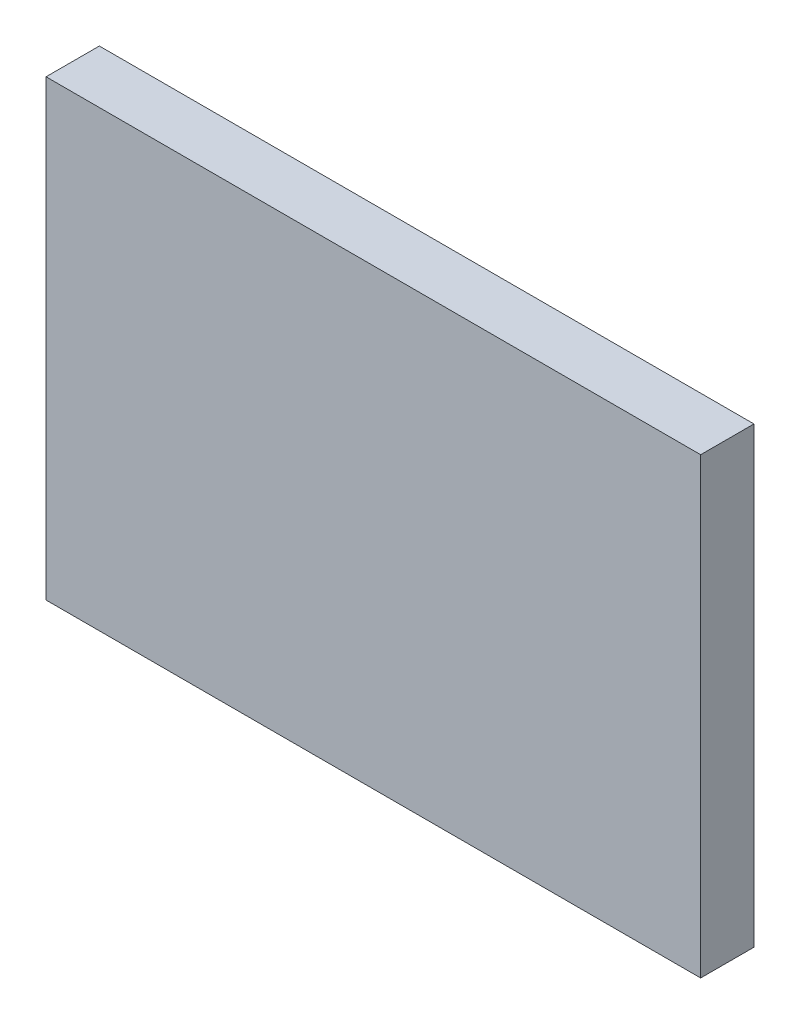
ISO-10303-21;
HEADER;
FILE_DESCRIPTION(('STEP AP214'),'2;1');
FILE_NAME('part.step','',(''),(''),'','','');
FILE_SCHEMA(('AUTOMOTIVE_DESIGN { 1 0 10303 214 1 1 1 1 }'));
ENDSEC;
DATA;
#1=APPLICATION_CONTEXT('core data for automotive mechanical design processes');
#2=APPLICATION_PROTOCOL_DEFINITION('international standard','automotive_design',2000,#1);
#3=PRODUCT_CONTEXT('',#1,'mechanical');
#4=PRODUCT('Part','Part','',(#3));
#5=PRODUCT_RELATED_PRODUCT_CATEGORY('part','',(#4));
#6=PRODUCT_DEFINITION_FORMATION('','',#4);
#7=PRODUCT_DEFINITION_CONTEXT('part definition',#1,'design');
#8=PRODUCT_DEFINITION('design','',#6,#7);
#9=PRODUCT_DEFINITION_SHAPE('','',#8);
#10=(LENGTH_UNIT() NAMED_UNIT(*) SI_UNIT(.MILLI.,.METRE.));
#11=(NAMED_UNIT(*) PLANE_ANGLE_UNIT() SI_UNIT($,.RADIAN.));
#12=(NAMED_UNIT(*) SI_UNIT($,.STERADIAN.) SOLID_ANGLE_UNIT());
#13=UNCERTAINTY_MEASURE_WITH_UNIT(LENGTH_MEASURE(1.E-05),#10,'distance_accuracy_value','');
#14=(GEOMETRIC_REPRESENTATION_CONTEXT(3) GLOBAL_UNCERTAINTY_ASSIGNED_CONTEXT((#13)) GLOBAL_UNIT_ASSIGNED_CONTEXT((#10,
#11,#12)) REPRESENTATION_CONTEXT('',''));
#15=CARTESIAN_POINT('',(0.,0.,0.));
#16=DIRECTION('',(0.,0.,1.));
#17=DIRECTION('',(1.,0.,0.));
#18=AXIS2_PLACEMENT_3D('',#15,#16,#17);
#19=CARTESIAN_POINT('',(-19.5,-13.5,3.175));
#20=DIRECTION('',(1.,0.,0.));
#21=DIRECTION('',(0.,0.,-1.));
#22=AXIS2_PLACEMENT_3D('',#19,#20,#21);
#23=PLANE('',#22);
#24=DIRECTION('',(0.,-1.,0.));
#25=VECTOR('',#24,1.);
#26=CARTESIAN_POINT('',(-19.5,-13.5,0.));
#27=LINE('',#26,#25);
#28=CARTESIAN_POINT('',(-19.5,13.5,0.));
#29=VERTEX_POINT('',#28);
#30=CARTESIAN_POINT('',(-19.5,-13.5,0.));
#31=VERTEX_POINT('',#30);
#32=EDGE_CURVE('E96',#29,#31,#27,.T.);
#33=ORIENTED_EDGE('',*,*,#32,.T.);
#34=DIRECTION('',(0.,0.,-1.));
#35=VECTOR('',#34,1.);
#36=CARTESIAN_POINT('',(-19.5,-13.5,3.175));
#37=LINE('',#36,#35);
#38=CARTESIAN_POINT('',(-19.5,-13.5,3.175));
#39=VERTEX_POINT('',#38);
#40=EDGE_CURVE('E11',#39,#31,#37,.T.);
#41=ORIENTED_EDGE('',*,*,#40,.F.);
#42=DIRECTION('',(0.,-1.,0.));
#43=VECTOR('',#42,1.);
#44=CARTESIAN_POINT('',(-19.5,-13.5,3.175));
#45=LINE('',#44,#43);
#46=CARTESIAN_POINT('',(-19.5,13.5,3.175));
#47=VERTEX_POINT('',#46);
#48=EDGE_CURVE('E84',#47,#39,#45,.T.);
#49=ORIENTED_EDGE('',*,*,#48,.F.);
#50=DIRECTION('',(0.,0.,-1.));
#51=VECTOR('',#50,1.);
#52=CARTESIAN_POINT('',(-19.5,13.5,3.175));
#53=LINE('',#52,#51);
#54=EDGE_CURVE('E92',#47,#29,#53,.T.);
#55=ORIENTED_EDGE('',*,*,#54,.T.);
#56=EDGE_LOOP('',(#33,#41,#49,#55));
#57=FACE_BOUND('',#56,.T.);
#58=ADVANCED_FACE('F33',(#57),#23,.F.);
#59=CARTESIAN_POINT('',(19.5,-13.5,3.175));
#60=DIRECTION('',(0.,1.,0.));
#61=DIRECTION('',(-1.,0.,0.));
#62=AXIS2_PLACEMENT_3D('',#59,#60,#61);
#63=PLANE('',#62);
#64=DIRECTION('',(1.,0.,0.));
#65=VECTOR('',#64,1.);
#66=CARTESIAN_POINT('',(19.5,-13.5,0.));
#67=LINE('',#66,#65);
#68=CARTESIAN_POINT('',(19.5,-13.5,0.));
#69=VERTEX_POINT('',#68);
#70=EDGE_CURVE('E88',#31,#69,#67,.T.);
#71=ORIENTED_EDGE('',*,*,#70,.T.);
#72=DIRECTION('',(0.,0.,-1.));
#73=VECTOR('',#72,1.);
#74=CARTESIAN_POINT('',(19.5,-13.5,3.175));
#75=LINE('',#74,#73);
#76=CARTESIAN_POINT('',(19.5,-13.5,3.175));
#77=VERTEX_POINT('',#76);
#78=EDGE_CURVE('E41',#77,#69,#75,.T.);
#79=ORIENTED_EDGE('',*,*,#78,.F.);
#80=DIRECTION('',(1.,0.,0.));
#81=VECTOR('',#80,1.);
#82=CARTESIAN_POINT('',(19.5,-13.5,3.175));
#83=LINE('',#82,#81);
#84=EDGE_CURVE('E79',#39,#77,#83,.T.);
#85=ORIENTED_EDGE('',*,*,#84,.F.);
#86=ORIENTED_EDGE('',*,*,#40,.T.);
#87=EDGE_LOOP('',(#71,#79,#85,#86));
#88=FACE_BOUND('',#87,.T.);
#89=ADVANCED_FACE('F87',(#88),#63,.F.);
#90=CARTESIAN_POINT('',(19.5,-13.5,3.175));
#91=DIRECTION('',(-1.,0.,0.));
#92=DIRECTION('',(0.,0.,1.));
#93=AXIS2_PLACEMENT_3D('',#90,#91,#92);
#94=PLANE('',#93);
#95=DIRECTION('',(0.,1.,0.));
#96=VECTOR('',#95,1.);
#97=CARTESIAN_POINT('',(19.5,-13.5,0.));
#98=LINE('',#97,#96);
#99=CARTESIAN_POINT('',(19.5,13.5,0.));
#100=VERTEX_POINT('',#99);
#101=EDGE_CURVE('E66',#69,#100,#98,.T.);
#102=ORIENTED_EDGE('',*,*,#101,.T.);
#103=DIRECTION('',(0.,0.,-1.));
#104=VECTOR('',#103,1.);
#105=CARTESIAN_POINT('',(19.5,13.5,3.175));
#106=LINE('',#105,#104);
#107=CARTESIAN_POINT('',(19.5,13.5,3.175));
#108=VERTEX_POINT('',#107);
#109=EDGE_CURVE('E89',#108,#100,#106,.T.);
#110=ORIENTED_EDGE('',*,*,#109,.F.);
#111=DIRECTION('',(0.,1.,0.));
#112=VECTOR('',#111,1.);
#113=CARTESIAN_POINT('',(19.5,-13.5,3.175));
#114=LINE('',#113,#112);
#115=EDGE_CURVE('E82',#77,#108,#114,.T.);
#116=ORIENTED_EDGE('',*,*,#115,.F.);
#117=ORIENTED_EDGE('',*,*,#78,.T.);
#118=EDGE_LOOP('',(#102,#110,#116,#117));
#119=FACE_BOUND('',#118,.T.);
#120=ADVANCED_FACE('F90',(#119),#94,.F.);
#121=CARTESIAN_POINT('',(19.5,13.5,3.175));
#122=DIRECTION('',(0.,-1.,0.));
#123=DIRECTION('',(1.,0.,0.));
#124=AXIS2_PLACEMENT_3D('',#121,#122,#123);
#125=PLANE('',#124);
#126=DIRECTION('',(-1.,0.,0.));
#127=VECTOR('',#126,1.);
#128=CARTESIAN_POINT('',(19.5,13.5,0.));
#129=LINE('',#128,#127);
#130=EDGE_CURVE('E72',#100,#29,#129,.T.);
#131=ORIENTED_EDGE('',*,*,#130,.T.);
#132=ORIENTED_EDGE('',*,*,#54,.F.);
#133=DIRECTION('',(-1.,0.,0.));
#134=VECTOR('',#133,1.);
#135=CARTESIAN_POINT('',(19.5,13.5,3.175));
#136=LINE('',#135,#134);
#137=EDGE_CURVE('E49',#108,#47,#136,.T.);
#138=ORIENTED_EDGE('',*,*,#137,.F.);
#139=ORIENTED_EDGE('',*,*,#109,.T.);
#140=EDGE_LOOP('',(#131,#132,#138,#139));
#141=FACE_BOUND('',#140,.T.);
#142=ADVANCED_FACE('F103',(#141),#125,.F.);
#143=CARTESIAN_POINT('',(0.,0.,3.175));
#144=DIRECTION('',(0.,0.,1.));
#145=DIRECTION('',(1.,0.,0.));
#146=AXIS2_PLACEMENT_3D('',#143,#144,#145);
#147=PLANE('',#146);
#148=ORIENTED_EDGE('',*,*,#48,.T.);
#149=ORIENTED_EDGE('',*,*,#84,.T.);
#150=ORIENTED_EDGE('',*,*,#115,.T.);
#151=ORIENTED_EDGE('',*,*,#137,.T.);
#152=EDGE_LOOP('',(#148,#149,#150,#151));
#153=FACE_BOUND('',#152,.T.);
#154=ADVANCED_FACE('F80',(#153),#147,.T.);
#155=CARTESIAN_POINT('',(0.,0.,0.));
#156=DIRECTION('',(0.,0.,1.));
#157=DIRECTION('',(1.,0.,0.));
#158=AXIS2_PLACEMENT_3D('',#155,#156,#157);
#159=PLANE('',#158);
#160=ORIENTED_EDGE('',*,*,#32,.F.);
#161=ORIENTED_EDGE('',*,*,#130,.F.);
#162=ORIENTED_EDGE('',*,*,#101,.F.);
#163=ORIENTED_EDGE('',*,*,#70,.F.);
#164=EDGE_LOOP('',(#160,#161,#162,#163));
#165=FACE_BOUND('',#164,.T.);
#166=ADVANCED_FACE('F106',(#165),#159,.F.);
#167=CLOSED_SHELL('',(#58,#89,#120,#142,#154,#166));
#168=MANIFOLD_SOLID_BREP('B2',#167);
#169=ADVANCED_BREP_SHAPE_REPRESENTATION('',(#18,#168),#14);
#170=SHAPE_DEFINITION_REPRESENTATION(#9,#169);
ENDSEC;
END-ISO-10303-21;
